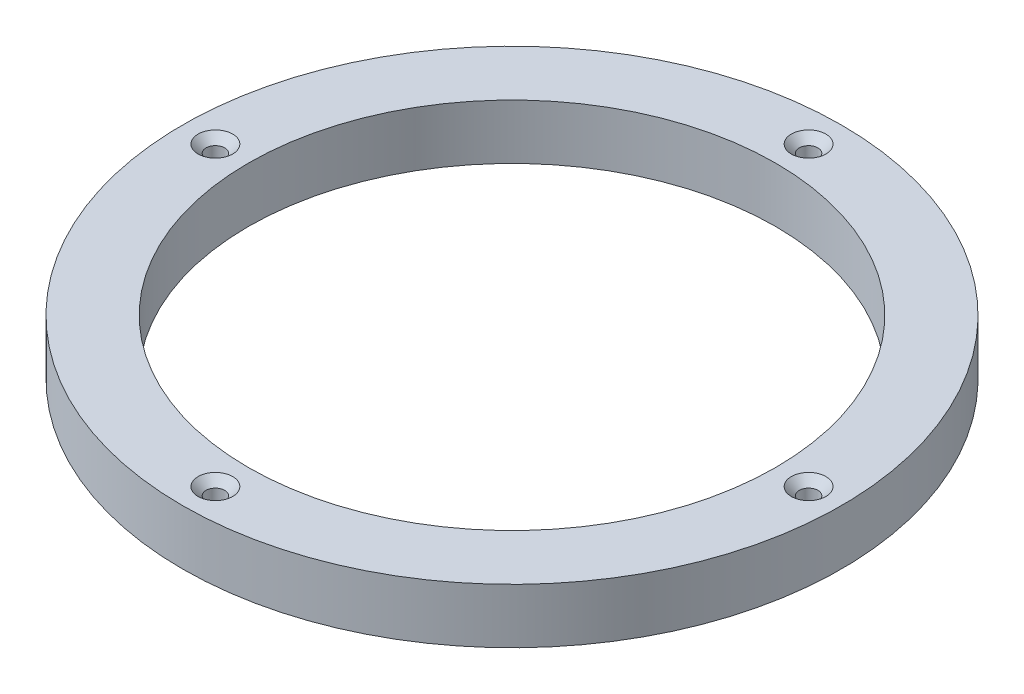
ISO-10303-21;
HEADER;
FILE_DESCRIPTION(('STEP AP214'),'2;1');
FILE_NAME('part.step','',(''),(''),'','','');
FILE_SCHEMA(('AUTOMOTIVE_DESIGN { 1 0 10303 214 1 1 1 1 }'));
ENDSEC;
DATA;
#1=APPLICATION_CONTEXT('core data for automotive mechanical design processes');
#2=APPLICATION_PROTOCOL_DEFINITION('international standard','automotive_design',2000,#1);
#3=PRODUCT_CONTEXT('',#1,'mechanical');
#4=PRODUCT('Part','Part','',(#3));
#5=PRODUCT_RELATED_PRODUCT_CATEGORY('part','',(#4));
#6=PRODUCT_DEFINITION_FORMATION('','',#4);
#7=PRODUCT_DEFINITION_CONTEXT('part definition',#1,'design');
#8=PRODUCT_DEFINITION('design','',#6,#7);
#9=PRODUCT_DEFINITION_SHAPE('','',#8);
#10=(LENGTH_UNIT() NAMED_UNIT(*) SI_UNIT(.MILLI.,.METRE.));
#11=(NAMED_UNIT(*) PLANE_ANGLE_UNIT() SI_UNIT($,.RADIAN.));
#12=(NAMED_UNIT(*) SI_UNIT($,.STERADIAN.) SOLID_ANGLE_UNIT());
#13=UNCERTAINTY_MEASURE_WITH_UNIT(LENGTH_MEASURE(1.E-05),#10,'distance_accuracy_value','');
#14=(GEOMETRIC_REPRESENTATION_CONTEXT(3) GLOBAL_UNCERTAINTY_ASSIGNED_CONTEXT((#13)) GLOBAL_UNIT_ASSIGNED_CONTEXT((#10,
#11,#12)) REPRESENTATION_CONTEXT('',''));
#15=CARTESIAN_POINT('',(0.,0.,0.));
#16=DIRECTION('',(0.,0.,1.));
#17=DIRECTION('',(1.,0.,0.));
#18=AXIS2_PLACEMENT_3D('',#15,#16,#17);
#19=CARTESIAN_POINT('',(0.,10.,0.));
#20=DIRECTION('',(0.,1.,0.));
#21=DIRECTION('',(0.,0.,1.));
#22=AXIS2_PLACEMENT_3D('',#19,#20,#21);
#23=PLANE('',#22);
#24=CARTESIAN_POINT('',(0.,10.,54.));
#25=DIRECTION('',(0.,1.,0.));
#26=DIRECTION('',(0.,0.,1.));
#27=AXIS2_PLACEMENT_3D('',#24,#25,#26);
#28=CIRCLE('',#27,3.15);
#29=CARTESIAN_POINT('',(0.,10.,57.15));
#30=VERTEX_POINT('',#29);
#31=EDGE_CURVE('E115',#30,#30,#28,.T.);
#32=ORIENTED_EDGE('',*,*,#31,.F.);
#33=EDGE_LOOP('',(#32));
#34=FACE_BOUND('',#33,.T.);
#35=CARTESIAN_POINT('',(54.,10.,0.));
#36=DIRECTION('',(0.,1.,0.));
#37=DIRECTION('',(0.,0.,1.));
#38=AXIS2_PLACEMENT_3D('',#35,#36,#37);
#39=CIRCLE('',#38,3.15);
#40=CARTESIAN_POINT('',(54.,10.,3.15));
#41=VERTEX_POINT('',#40);
#42=EDGE_CURVE('E72',#41,#41,#39,.T.);
#43=ORIENTED_EDGE('',*,*,#42,.F.);
#44=EDGE_LOOP('',(#43));
#45=FACE_BOUND('',#44,.T.);
#46=CARTESIAN_POINT('',(0.,10.,-54.));
#47=DIRECTION('',(0.,1.,0.));
#48=DIRECTION('',(0.,0.,1.));
#49=AXIS2_PLACEMENT_3D('',#46,#47,#48);
#50=CIRCLE('',#49,3.15);
#51=CARTESIAN_POINT('',(0.,10.,-50.85));
#52=VERTEX_POINT('',#51);
#53=EDGE_CURVE('E65',#52,#52,#50,.T.);
#54=ORIENTED_EDGE('',*,*,#53,.F.);
#55=EDGE_LOOP('',(#54));
#56=FACE_BOUND('',#55,.T.);
#57=CARTESIAN_POINT('',(-54.,10.,0.));
#58=DIRECTION('',(0.,1.,0.));
#59=DIRECTION('',(0.,0.,1.));
#60=AXIS2_PLACEMENT_3D('',#57,#58,#59);
#61=CIRCLE('',#60,3.15);
#62=CARTESIAN_POINT('',(-54.,10.,3.15));
#63=VERTEX_POINT('',#62);
#64=EDGE_CURVE('E61',#63,#63,#61,.T.);
#65=ORIENTED_EDGE('',*,*,#64,.F.);
#66=EDGE_LOOP('',(#65));
#67=FACE_BOUND('',#66,.T.);
#68=CARTESIAN_POINT('',(0.,10.,0.));
#69=DIRECTION('',(0.,1.,0.));
#70=DIRECTION('',(0.,0.,1.));
#71=AXIS2_PLACEMENT_3D('',#68,#69,#70);
#72=CIRCLE('',#71,60.);
#73=CARTESIAN_POINT('',(0.,10.,60.));
#74=VERTEX_POINT('',#73);
#75=EDGE_CURVE('E10',#74,#74,#72,.T.);
#76=ORIENTED_EDGE('',*,*,#75,.T.);
#77=EDGE_LOOP('',(#76));
#78=FACE_BOUND('',#77,.T.);
#79=CARTESIAN_POINT('',(0.,10.,0.));
#80=DIRECTION('',(0.,1.,0.));
#81=DIRECTION('',(0.,0.,1.));
#82=AXIS2_PLACEMENT_3D('',#79,#80,#81);
#83=CIRCLE('',#82,48.);
#84=CARTESIAN_POINT('',(0.,10.,48.));
#85=VERTEX_POINT('',#84);
#86=EDGE_CURVE('E49',#85,#85,#83,.T.);
#87=ORIENTED_EDGE('',*,*,#86,.F.);
#88=EDGE_LOOP('',(#87));
#89=FACE_BOUND('',#88,.T.);
#90=ADVANCED_FACE('F36',(#34,#45,#56,#67,#78,#89),#23,.T.);
#91=CARTESIAN_POINT('',(0.,0.,0.));
#92=DIRECTION('',(0.,1.,0.));
#93=DIRECTION('',(0.,0.,1.));
#94=AXIS2_PLACEMENT_3D('',#91,#92,#93);
#95=PLANE('',#94);
#96=CARTESIAN_POINT('',(0.,0.,54.));
#97=DIRECTION('',(0.,1.,0.));
#98=DIRECTION('',(0.,0.,1.));
#99=AXIS2_PLACEMENT_3D('',#96,#97,#98);
#100=CIRCLE('',#99,1.69999999999998);
#101=CARTESIAN_POINT('',(0.,0.,55.7));
#102=VERTEX_POINT('',#101);
#103=EDGE_CURVE('E40',#102,#102,#100,.T.);
#104=ORIENTED_EDGE('',*,*,#103,.T.);
#105=EDGE_LOOP('',(#104));
#106=FACE_BOUND('',#105,.T.);
#107=CARTESIAN_POINT('',(54.,0.,0.));
#108=DIRECTION('',(0.,1.,0.));
#109=DIRECTION('',(0.,0.,1.));
#110=AXIS2_PLACEMENT_3D('',#107,#108,#109);
#111=CIRCLE('',#110,1.69999999999998);
#112=CARTESIAN_POINT('',(54.,0.,1.69999999999998));
#113=VERTEX_POINT('',#112);
#114=EDGE_CURVE('E63',#113,#113,#111,.T.);
#115=ORIENTED_EDGE('',*,*,#114,.T.);
#116=EDGE_LOOP('',(#115));
#117=FACE_BOUND('',#116,.T.);
#118=CARTESIAN_POINT('',(0.,0.,-54.));
#119=DIRECTION('',(0.,1.,0.));
#120=DIRECTION('',(0.,0.,1.));
#121=AXIS2_PLACEMENT_3D('',#118,#119,#120);
#122=CIRCLE('',#121,1.69999999999998);
#123=CARTESIAN_POINT('',(0.,0.,-52.3));
#124=VERTEX_POINT('',#123);
#125=EDGE_CURVE('E59',#124,#124,#122,.T.);
#126=ORIENTED_EDGE('',*,*,#125,.T.);
#127=EDGE_LOOP('',(#126));
#128=FACE_BOUND('',#127,.T.);
#129=CARTESIAN_POINT('',(-54.,0.,0.));
#130=DIRECTION('',(0.,1.,0.));
#131=DIRECTION('',(0.,0.,1.));
#132=AXIS2_PLACEMENT_3D('',#129,#130,#131);
#133=CIRCLE('',#132,1.69999999999998);
#134=CARTESIAN_POINT('',(-54.,0.,1.69999999999998));
#135=VERTEX_POINT('',#134);
#136=EDGE_CURVE('E55',#135,#135,#133,.T.);
#137=ORIENTED_EDGE('',*,*,#136,.T.);
#138=EDGE_LOOP('',(#137));
#139=FACE_BOUND('',#138,.T.);
#140=CARTESIAN_POINT('',(0.,0.,0.));
#141=DIRECTION('',(0.,1.,0.));
#142=DIRECTION('',(0.,0.,1.));
#143=AXIS2_PLACEMENT_3D('',#140,#141,#142);
#144=CIRCLE('',#143,60.);
#145=CARTESIAN_POINT('',(0.,0.,60.));
#146=VERTEX_POINT('',#145);
#147=EDGE_CURVE('E44',#146,#146,#144,.T.);
#148=ORIENTED_EDGE('',*,*,#147,.F.);
#149=EDGE_LOOP('',(#148));
#150=FACE_BOUND('',#149,.T.);
#151=CARTESIAN_POINT('',(0.,0.,0.));
#152=DIRECTION('',(0.,1.,0.));
#153=DIRECTION('',(0.,0.,1.));
#154=AXIS2_PLACEMENT_3D('',#151,#152,#153);
#155=CIRCLE('',#154,48.);
#156=CARTESIAN_POINT('',(0.,0.,48.));
#157=VERTEX_POINT('',#156);
#158=EDGE_CURVE('E52',#157,#157,#155,.T.);
#159=ORIENTED_EDGE('',*,*,#158,.T.);
#160=EDGE_LOOP('',(#159));
#161=FACE_BOUND('',#160,.T.);
#162=ADVANCED_FACE('F91',(#106,#117,#128,#139,#150,#161),#95,.F.);
#163=CARTESIAN_POINT('',(0.,10.,0.));
#164=DIRECTION('',(0.,-1.,0.));
#165=DIRECTION('',(0.,0.,-1.));
#166=AXIS2_PLACEMENT_3D('',#163,#164,#165);
#167=CYLINDRICAL_SURFACE('',#166,60.);
#168=ORIENTED_EDGE('',*,*,#75,.F.);
#169=EDGE_LOOP('',(#168));
#170=FACE_BOUND('',#169,.T.);
#171=ORIENTED_EDGE('',*,*,#147,.T.);
#172=EDGE_LOOP('',(#171));
#173=FACE_BOUND('',#172,.T.);
#174=ADVANCED_FACE('F38',(#170,#173),#167,.T.);
#175=CARTESIAN_POINT('',(0.,10.,0.));
#176=DIRECTION('',(0.,-1.,0.));
#177=DIRECTION('',(0.,0.,-1.));
#178=AXIS2_PLACEMENT_3D('',#175,#176,#177);
#179=CYLINDRICAL_SURFACE('',#178,48.);
#180=ORIENTED_EDGE('',*,*,#86,.T.);
#181=EDGE_LOOP('',(#180));
#182=FACE_BOUND('',#181,.T.);
#183=ORIENTED_EDGE('',*,*,#158,.F.);
#184=EDGE_LOOP('',(#183));
#185=FACE_BOUND('',#184,.T.);
#186=ADVANCED_FACE('F93',(#182,#185),#179,.F.);
#187=CARTESIAN_POINT('',(-54.,10.,0.));
#188=DIRECTION('',(0.,1.,0.));
#189=DIRECTION('',(0.,0.,1.));
#190=AXIS2_PLACEMENT_3D('',#187,#188,#189);
#191=CYLINDRICAL_SURFACE('',#190,1.69999999999998);
#192=CARTESIAN_POINT('',(-54.,8.55,0.));
#193=DIRECTION('',(0.,1.,0.));
#194=DIRECTION('',(0.,0.,1.));
#195=AXIS2_PLACEMENT_3D('',#192,#193,#194);
#196=CIRCLE('',#195,1.69999999999999);
#197=CARTESIAN_POINT('',(-54.,8.55,1.69999999999999));
#198=VERTEX_POINT('',#197);
#199=EDGE_CURVE('E58',#198,#198,#196,.T.);
#200=ORIENTED_EDGE('',*,*,#199,.T.);
#201=EDGE_LOOP('',(#200));
#202=FACE_BOUND('',#201,.T.);
#203=ORIENTED_EDGE('',*,*,#136,.F.);
#204=EDGE_LOOP('',(#203));
#205=FACE_BOUND('',#204,.T.);
#206=ADVANCED_FACE('F95',(#202,#205),#191,.F.);
#207=CARTESIAN_POINT('',(-54.,10.,0.));
#208=DIRECTION('',(0.,1.,0.));
#209=DIRECTION('',(0.,0.,1.));
#210=AXIS2_PLACEMENT_3D('',#207,#208,#209);
#211=CONICAL_SURFACE('',#210,3.15,0.78539816339745);
#212=ORIENTED_EDGE('',*,*,#199,.F.);
#213=EDGE_LOOP('',(#212));
#214=FACE_BOUND('',#213,.T.);
#215=ORIENTED_EDGE('',*,*,#64,.T.);
#216=EDGE_LOOP('',(#215));
#217=FACE_BOUND('',#216,.T.);
#218=ADVANCED_FACE('F101',(#214,#217),#211,.F.);
#219=CARTESIAN_POINT('',(0.,10.,-54.));
#220=DIRECTION('',(0.,1.,0.));
#221=DIRECTION('',(0.,0.,1.));
#222=AXIS2_PLACEMENT_3D('',#219,#220,#221);
#223=CYLINDRICAL_SURFACE('',#222,1.69999999999998);
#224=CARTESIAN_POINT('',(0.,8.55,-54.));
#225=DIRECTION('',(0.,1.,0.));
#226=DIRECTION('',(0.,0.,1.));
#227=AXIS2_PLACEMENT_3D('',#224,#225,#226);
#228=CIRCLE('',#227,1.69999999999999);
#229=CARTESIAN_POINT('',(0.,8.55,-52.3));
#230=VERTEX_POINT('',#229);
#231=EDGE_CURVE('E62',#230,#230,#228,.T.);
#232=ORIENTED_EDGE('',*,*,#231,.T.);
#233=EDGE_LOOP('',(#232));
#234=FACE_BOUND('',#233,.T.);
#235=ORIENTED_EDGE('',*,*,#125,.F.);
#236=EDGE_LOOP('',(#235));
#237=FACE_BOUND('',#236,.T.);
#238=ADVANCED_FACE('F124',(#234,#237),#223,.F.);
#239=CARTESIAN_POINT('',(0.,10.,-54.));
#240=DIRECTION('',(0.,1.,0.));
#241=DIRECTION('',(0.,0.,1.));
#242=AXIS2_PLACEMENT_3D('',#239,#240,#241);
#243=CONICAL_SURFACE('',#242,3.15,0.78539816339745);
#244=ORIENTED_EDGE('',*,*,#231,.F.);
#245=EDGE_LOOP('',(#244));
#246=FACE_BOUND('',#245,.T.);
#247=ORIENTED_EDGE('',*,*,#53,.T.);
#248=EDGE_LOOP('',(#247));
#249=FACE_BOUND('',#248,.T.);
#250=ADVANCED_FACE('F130',(#246,#249),#243,.F.);
#251=CARTESIAN_POINT('',(54.,10.,0.));
#252=DIRECTION('',(0.,1.,0.));
#253=DIRECTION('',(0.,0.,1.));
#254=AXIS2_PLACEMENT_3D('',#251,#252,#253);
#255=CYLINDRICAL_SURFACE('',#254,1.69999999999998);
#256=CARTESIAN_POINT('',(54.,8.55,0.));
#257=DIRECTION('',(0.,1.,0.));
#258=DIRECTION('',(0.,0.,1.));
#259=AXIS2_PLACEMENT_3D('',#256,#257,#258);
#260=CIRCLE('',#259,1.69999999999999);
#261=CARTESIAN_POINT('',(54.,8.55,1.69999999999999));
#262=VERTEX_POINT('',#261);
#263=EDGE_CURVE('E66',#262,#262,#260,.T.);
#264=ORIENTED_EDGE('',*,*,#263,.T.);
#265=EDGE_LOOP('',(#264));
#266=FACE_BOUND('',#265,.T.);
#267=ORIENTED_EDGE('',*,*,#114,.F.);
#268=EDGE_LOOP('',(#267));
#269=FACE_BOUND('',#268,.T.);
#270=ADVANCED_FACE('F137',(#266,#269),#255,.F.);
#271=CARTESIAN_POINT('',(54.,10.,0.));
#272=DIRECTION('',(0.,1.,0.));
#273=DIRECTION('',(0.,0.,1.));
#274=AXIS2_PLACEMENT_3D('',#271,#272,#273);
#275=CONICAL_SURFACE('',#274,3.15,0.78539816339745);
#276=ORIENTED_EDGE('',*,*,#263,.F.);
#277=EDGE_LOOP('',(#276));
#278=FACE_BOUND('',#277,.T.);
#279=ORIENTED_EDGE('',*,*,#42,.T.);
#280=EDGE_LOOP('',(#279));
#281=FACE_BOUND('',#280,.T.);
#282=ADVANCED_FACE('F141',(#278,#281),#275,.F.);
#283=CARTESIAN_POINT('',(0.,10.,54.));
#284=DIRECTION('',(0.,1.,0.));
#285=DIRECTION('',(0.,0.,1.));
#286=AXIS2_PLACEMENT_3D('',#283,#284,#285);
#287=CYLINDRICAL_SURFACE('',#286,1.69999999999998);
#288=CARTESIAN_POINT('',(0.,8.55,54.));
#289=DIRECTION('',(0.,1.,0.));
#290=DIRECTION('',(0.,0.,1.));
#291=AXIS2_PLACEMENT_3D('',#288,#289,#290);
#292=CIRCLE('',#291,1.69999999999999);
#293=CARTESIAN_POINT('',(0.,8.55,55.7));
#294=VERTEX_POINT('',#293);
#295=EDGE_CURVE('E157',#294,#294,#292,.T.);
#296=ORIENTED_EDGE('',*,*,#295,.T.);
#297=EDGE_LOOP('',(#296));
#298=FACE_BOUND('',#297,.T.);
#299=ORIENTED_EDGE('',*,*,#103,.F.);
#300=EDGE_LOOP('',(#299));
#301=FACE_BOUND('',#300,.T.);
#302=ADVANCED_FACE('F144',(#298,#301),#287,.F.);
#303=CARTESIAN_POINT('',(0.,10.,54.));
#304=DIRECTION('',(0.,1.,0.));
#305=DIRECTION('',(0.,0.,1.));
#306=AXIS2_PLACEMENT_3D('',#303,#304,#305);
#307=CONICAL_SURFACE('',#306,3.15,0.78539816339745);
#308=ORIENTED_EDGE('',*,*,#295,.F.);
#309=EDGE_LOOP('',(#308));
#310=FACE_BOUND('',#309,.T.);
#311=ORIENTED_EDGE('',*,*,#31,.T.);
#312=EDGE_LOOP('',(#311));
#313=FACE_BOUND('',#312,.T.);
#314=ADVANCED_FACE('F148',(#310,#313),#307,.F.);
#315=CLOSED_SHELL('',(#90,#162,#174,#186,#206,#218,#238,#250,#270,#282,#302,#314));
#316=MANIFOLD_SOLID_BREP('B2',#315);
#317=ADVANCED_BREP_SHAPE_REPRESENTATION('',(#18,#316),#14);
#318=SHAPE_DEFINITION_REPRESENTATION(#9,#317);
ENDSEC;
END-ISO-10303-21;
